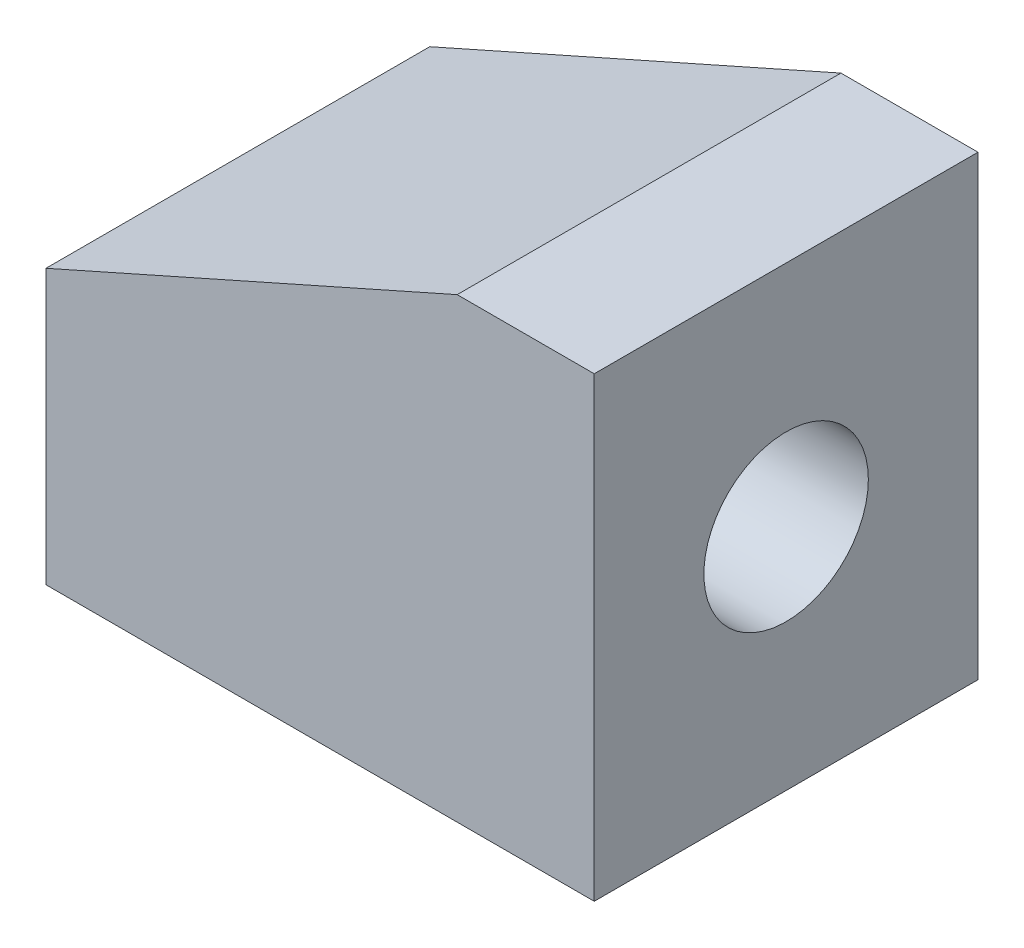
ISO-10303-21;
HEADER;
FILE_DESCRIPTION(('STEP AP214'),'2;1');
FILE_NAME('part.step','',(''),(''),'','','');
FILE_SCHEMA(('AUTOMOTIVE_DESIGN { 1 0 10303 214 1 1 1 1 }'));
ENDSEC;
DATA;
#1=APPLICATION_CONTEXT('core data for automotive mechanical design processes');
#2=APPLICATION_PROTOCOL_DEFINITION('international standard','automotive_design',2000,#1);
#3=PRODUCT_CONTEXT('',#1,'mechanical');
#4=PRODUCT('Part','Part','',(#3));
#5=PRODUCT_RELATED_PRODUCT_CATEGORY('part','',(#4));
#6=PRODUCT_DEFINITION_FORMATION('','',#4);
#7=PRODUCT_DEFINITION_CONTEXT('part definition',#1,'design');
#8=PRODUCT_DEFINITION('design','',#6,#7);
#9=PRODUCT_DEFINITION_SHAPE('','',#8);
#10=(LENGTH_UNIT() NAMED_UNIT(*) SI_UNIT(.MILLI.,.METRE.));
#11=(NAMED_UNIT(*) PLANE_ANGLE_UNIT() SI_UNIT($,.RADIAN.));
#12=(NAMED_UNIT(*) SI_UNIT($,.STERADIAN.) SOLID_ANGLE_UNIT());
#13=UNCERTAINTY_MEASURE_WITH_UNIT(LENGTH_MEASURE(1.E-05),#10,'distance_accuracy_value','');
#14=(GEOMETRIC_REPRESENTATION_CONTEXT(3) GLOBAL_UNCERTAINTY_ASSIGNED_CONTEXT((#13)) GLOBAL_UNIT_ASSIGNED_CONTEXT((#10,
#11,#12)) REPRESENTATION_CONTEXT('',''));
#15=CARTESIAN_POINT('',(0.,0.,0.));
#16=DIRECTION('',(0.,0.,1.));
#17=DIRECTION('',(1.,0.,0.));
#18=AXIS2_PLACEMENT_3D('',#15,#16,#17);
#19=CARTESIAN_POINT('',(-36.502189772804,37.1488764044944,42.));
#20=DIRECTION('',(0.406138466053448,-0.913811548620257,0.));
#21=DIRECTION('',(0.913811548620257,0.406138466053448,0.));
#22=AXIS2_PLACEMENT_3D('',#19,#20,#21);
#23=PLANE('',#22);
#24=DIRECTION('',(-0.913811548620257,-0.406138466053448,0.));
#25=VECTOR('',#24,1.);
#26=CARTESIAN_POINT('',(-36.502189772804,37.1488764044944,0.));
#27=LINE('',#26,#25);
#28=CARTESIAN_POINT('',(-36.502189772804,37.1488764044944,0.));
#29=VERTEX_POINT('',#28);
#30=CARTESIAN_POINT('',(-81.502189772804,17.1488764044944,0.));
#31=VERTEX_POINT('',#30);
#32=EDGE_CURVE('E124',#29,#31,#27,.T.);
#33=ORIENTED_EDGE('',*,*,#32,.T.);
#34=DIRECTION('',(0.,0.,-1.));
#35=VECTOR('',#34,1.);
#36=CARTESIAN_POINT('',(-81.502189772804,17.1488764044944,42.));
#37=LINE('',#36,#35);
#38=CARTESIAN_POINT('',(-81.502189772804,17.1488764044944,42.));
#39=VERTEX_POINT('',#38);
#40=EDGE_CURVE('E11',#39,#31,#37,.T.);
#41=ORIENTED_EDGE('',*,*,#40,.F.);
#42=DIRECTION('',(-0.913811548620257,-0.406138466053448,0.));
#43=VECTOR('',#42,1.);
#44=CARTESIAN_POINT('',(-36.502189772804,37.1488764044944,42.));
#45=LINE('',#44,#43);
#46=CARTESIAN_POINT('',(-36.502189772804,37.1488764044944,42.));
#47=VERTEX_POINT('',#46);
#48=EDGE_CURVE('E138',#47,#39,#45,.T.);
#49=ORIENTED_EDGE('',*,*,#48,.F.);
#50=DIRECTION('',(0.,0.,-1.));
#51=VECTOR('',#50,1.);
#52=CARTESIAN_POINT('',(-36.502189772804,37.1488764044944,42.));
#53=LINE('',#52,#51);
#54=EDGE_CURVE('E120',#47,#29,#53,.T.);
#55=ORIENTED_EDGE('',*,*,#54,.T.);
#56=EDGE_LOOP('',(#33,#41,#49,#55));
#57=FACE_BOUND('',#56,.T.);
#58=ADVANCED_FACE('F45',(#57),#23,.F.);
#59=CARTESIAN_POINT('',(-81.502189772804,17.1488764044944,42.));
#60=DIRECTION('',(1.,0.,0.));
#61=DIRECTION('',(0.,0.,-1.));
#62=AXIS2_PLACEMENT_3D('',#59,#60,#61);
#63=PLANE('',#62);
#64=DIRECTION('',(0.,-1.,0.));
#65=VECTOR('',#64,1.);
#66=CARTESIAN_POINT('',(-81.502189772804,17.1488764044944,0.));
#67=LINE('',#66,#65);
#68=CARTESIAN_POINT('',(-81.502189772804,-12.8511235955056,0.));
#69=VERTEX_POINT('',#68);
#70=EDGE_CURVE('E128',#31,#69,#67,.T.);
#71=ORIENTED_EDGE('',*,*,#70,.T.);
#72=DIRECTION('',(0.,0.,-1.));
#73=VECTOR('',#72,1.);
#74=CARTESIAN_POINT('',(-81.502189772804,-12.8511235955056,42.));
#75=LINE('',#74,#73);
#76=CARTESIAN_POINT('',(-81.502189772804,-12.8511235955056,42.));
#77=VERTEX_POINT('',#76);
#78=EDGE_CURVE('E54',#77,#69,#75,.T.);
#79=ORIENTED_EDGE('',*,*,#78,.F.);
#80=DIRECTION('',(0.,-1.,0.));
#81=VECTOR('',#80,1.);
#82=CARTESIAN_POINT('',(-81.502189772804,17.1488764044944,42.));
#83=LINE('',#82,#81);
#84=EDGE_CURVE('E96',#39,#77,#83,.T.);
#85=ORIENTED_EDGE('',*,*,#84,.F.);
#86=ORIENTED_EDGE('',*,*,#40,.T.);
#87=EDGE_LOOP('',(#71,#79,#85,#86));
#88=FACE_BOUND('',#87,.T.);
#89=ADVANCED_FACE('F162',(#88),#63,.F.);
#90=CARTESIAN_POINT('',(-81.502189772804,-12.8511235955056,42.));
#91=DIRECTION('',(0.,1.,0.));
#92=DIRECTION('',(0.,0.,1.));
#93=AXIS2_PLACEMENT_3D('',#90,#91,#92);
#94=PLANE('',#93);
#95=DIRECTION('',(1.,0.,0.));
#96=VECTOR('',#95,1.);
#97=CARTESIAN_POINT('',(-81.502189772804,-12.8511235955056,0.));
#98=LINE('',#97,#96);
#99=CARTESIAN_POINT('',(-21.502189772804,-12.8511235955056,0.));
#100=VERTEX_POINT('',#99);
#101=EDGE_CURVE('E112',#69,#100,#98,.T.);
#102=ORIENTED_EDGE('',*,*,#101,.T.);
#103=DIRECTION('',(0.,0.,-1.));
#104=VECTOR('',#103,1.);
#105=CARTESIAN_POINT('',(-21.502189772804,-12.8511235955056,42.));
#106=LINE('',#105,#104);
#107=CARTESIAN_POINT('',(-21.502189772804,-12.8511235955056,42.));
#108=VERTEX_POINT('',#107);
#109=EDGE_CURVE('E109',#108,#100,#106,.T.);
#110=ORIENTED_EDGE('',*,*,#109,.F.);
#111=DIRECTION('',(1.,0.,0.));
#112=VECTOR('',#111,1.);
#113=CARTESIAN_POINT('',(-81.502189772804,-12.8511235955056,42.));
#114=LINE('',#113,#112);
#115=EDGE_CURVE('E100',#77,#108,#114,.T.);
#116=ORIENTED_EDGE('',*,*,#115,.F.);
#117=ORIENTED_EDGE('',*,*,#78,.T.);
#118=EDGE_LOOP('',(#102,#110,#116,#117));
#119=FACE_BOUND('',#118,.T.);
#120=ADVANCED_FACE('F110',(#119),#94,.F.);
#121=CARTESIAN_POINT('',(-21.502189772804,-12.8511235955056,42.));
#122=DIRECTION('',(-1.,0.,0.));
#123=DIRECTION('',(0.,0.,1.));
#124=AXIS2_PLACEMENT_3D('',#121,#122,#123);
#125=PLANE('',#124);
#126=CARTESIAN_POINT('',(-21.502189772804,12.1488764044944,21.));
#127=DIRECTION('',(1.,0.,0.));
#128=DIRECTION('',(0.,0.,-1.));
#129=AXIS2_PLACEMENT_3D('',#126,#127,#128);
#130=CIRCLE('',#129,9.);
#131=CARTESIAN_POINT('',(-21.502189772804,12.1488764044944,12.));
#132=VERTEX_POINT('',#131);
#133=EDGE_CURVE('E224',#132,#132,#130,.T.);
#134=ORIENTED_EDGE('',*,*,#133,.F.);
#135=EDGE_LOOP('',(#134));
#136=FACE_BOUND('',#135,.T.);
#137=DIRECTION('',(0.,1.,0.));
#138=VECTOR('',#137,1.);
#139=CARTESIAN_POINT('',(-21.502189772804,-12.8511235955056,0.));
#140=LINE('',#139,#138);
#141=CARTESIAN_POINT('',(-21.502189772804,37.1488764044944,0.));
#142=VERTEX_POINT('',#141);
#143=EDGE_CURVE('E82',#100,#142,#140,.T.);
#144=ORIENTED_EDGE('',*,*,#143,.T.);
#145=DIRECTION('',(0.,0.,-1.));
#146=VECTOR('',#145,1.);
#147=CARTESIAN_POINT('',(-21.502189772804,37.1488764044944,42.));
#148=LINE('',#147,#146);
#149=CARTESIAN_POINT('',(-21.502189772804,37.1488764044944,42.));
#150=VERTEX_POINT('',#149);
#151=EDGE_CURVE('E114',#150,#142,#148,.T.);
#152=ORIENTED_EDGE('',*,*,#151,.F.);
#153=DIRECTION('',(0.,1.,0.));
#154=VECTOR('',#153,1.);
#155=CARTESIAN_POINT('',(-21.502189772804,-12.8511235955056,42.));
#156=LINE('',#155,#154);
#157=EDGE_CURVE('E104',#108,#150,#156,.T.);
#158=ORIENTED_EDGE('',*,*,#157,.F.);
#159=ORIENTED_EDGE('',*,*,#109,.T.);
#160=EDGE_LOOP('',(#144,#152,#158,#159));
#161=FACE_BOUND('',#160,.T.);
#162=ADVANCED_FACE('F116',(#136,#161),#125,.F.);
#163=CARTESIAN_POINT('',(-21.502189772804,37.1488764044944,42.));
#164=DIRECTION('',(0.,-1.,0.));
#165=DIRECTION('',(0.,0.,-1.));
#166=AXIS2_PLACEMENT_3D('',#163,#164,#165);
#167=PLANE('',#166);
#168=DIRECTION('',(-1.,0.,0.));
#169=VECTOR('',#168,1.);
#170=CARTESIAN_POINT('',(-21.502189772804,37.1488764044944,0.));
#171=LINE('',#170,#169);
#172=EDGE_CURVE('E88',#142,#29,#171,.T.);
#173=ORIENTED_EDGE('',*,*,#172,.T.);
#174=ORIENTED_EDGE('',*,*,#54,.F.);
#175=DIRECTION('',(-1.,0.,0.));
#176=VECTOR('',#175,1.);
#177=CARTESIAN_POINT('',(-21.502189772804,37.1488764044944,42.));
#178=LINE('',#177,#176);
#179=EDGE_CURVE('E62',#150,#47,#178,.T.);
#180=ORIENTED_EDGE('',*,*,#179,.F.);
#181=ORIENTED_EDGE('',*,*,#151,.T.);
#182=EDGE_LOOP('',(#173,#174,#180,#181));
#183=FACE_BOUND('',#182,.T.);
#184=ADVANCED_FACE('F149',(#183),#167,.F.);
#185=CARTESIAN_POINT('',(0.,0.,42.));
#186=DIRECTION('',(0.,0.,1.));
#187=DIRECTION('',(1.,0.,0.));
#188=AXIS2_PLACEMENT_3D('',#185,#186,#187);
#189=PLANE('',#188);
#190=ORIENTED_EDGE('',*,*,#48,.T.);
#191=ORIENTED_EDGE('',*,*,#84,.T.);
#192=ORIENTED_EDGE('',*,*,#115,.T.);
#193=ORIENTED_EDGE('',*,*,#157,.T.);
#194=ORIENTED_EDGE('',*,*,#179,.T.);
#195=EDGE_LOOP('',(#190,#191,#192,#193,#194));
#196=FACE_BOUND('',#195,.T.);
#197=ADVANCED_FACE('F102',(#196),#189,.T.);
#198=CARTESIAN_POINT('',(0.,0.,0.));
#199=DIRECTION('',(0.,0.,1.));
#200=DIRECTION('',(1.,0.,0.));
#201=AXIS2_PLACEMENT_3D('',#198,#199,#200);
#202=PLANE('',#201);
#203=ORIENTED_EDGE('',*,*,#32,.F.);
#204=ORIENTED_EDGE('',*,*,#172,.F.);
#205=ORIENTED_EDGE('',*,*,#143,.F.);
#206=ORIENTED_EDGE('',*,*,#101,.F.);
#207=ORIENTED_EDGE('',*,*,#70,.F.);
#208=EDGE_LOOP('',(#203,#204,#205,#206,#207));
#209=FACE_BOUND('',#208,.T.);
#210=ADVANCED_FACE('F145',(#209),#202,.F.);
#211=CARTESIAN_POINT('',(-61.502189772804,12.1488764044944,21.));
#212=DIRECTION('',(1.,0.,0.));
#213=DIRECTION('',(0.,0.,-1.));
#214=AXIS2_PLACEMENT_3D('',#211,#212,#213);
#215=CYLINDRICAL_SURFACE('',#214,9.);
#216=CARTESIAN_POINT('',(-61.502189772804,12.1488764044944,21.));
#217=DIRECTION('',(1.,0.,0.));
#218=DIRECTION('',(0.,0.,-1.));
#219=AXIS2_PLACEMENT_3D('',#216,#217,#218);
#220=CIRCLE('',#219,9.);
#221=CARTESIAN_POINT('',(-61.502189772804,12.1488764044944,12.));
#222=VERTEX_POINT('',#221);
#223=EDGE_CURVE('E129',#222,#222,#220,.T.);
#224=ORIENTED_EDGE('',*,*,#223,.F.);
#225=EDGE_LOOP('',(#224));
#226=FACE_BOUND('',#225,.T.);
#227=ORIENTED_EDGE('',*,*,#133,.T.);
#228=EDGE_LOOP('',(#227));
#229=FACE_BOUND('',#228,.T.);
#230=ADVANCED_FACE('F201',(#226,#229),#215,.F.);
#231=CARTESIAN_POINT('',(-61.502189772804,12.1488764044944,21.));
#232=DIRECTION('',(1.,0.,0.));
#233=DIRECTION('',(0.,0.,-1.));
#234=AXIS2_PLACEMENT_3D('',#231,#232,#233);
#235=PLANE('',#234);
#236=ORIENTED_EDGE('',*,*,#223,.T.);
#237=EDGE_LOOP('',(#236));
#238=FACE_BOUND('',#237,.T.);
#239=ADVANCED_FACE('F208',(#238),#235,.T.);
#240=CLOSED_SHELL('',(#58,#89,#120,#162,#184,#197,#210,#230,#239));
#241=MANIFOLD_SOLID_BREP('B2',#240);
#242=ADVANCED_BREP_SHAPE_REPRESENTATION('',(#18,#241),#14);
#243=SHAPE_DEFINITION_REPRESENTATION(#9,#242);
ENDSEC;
END-ISO-10303-21;
